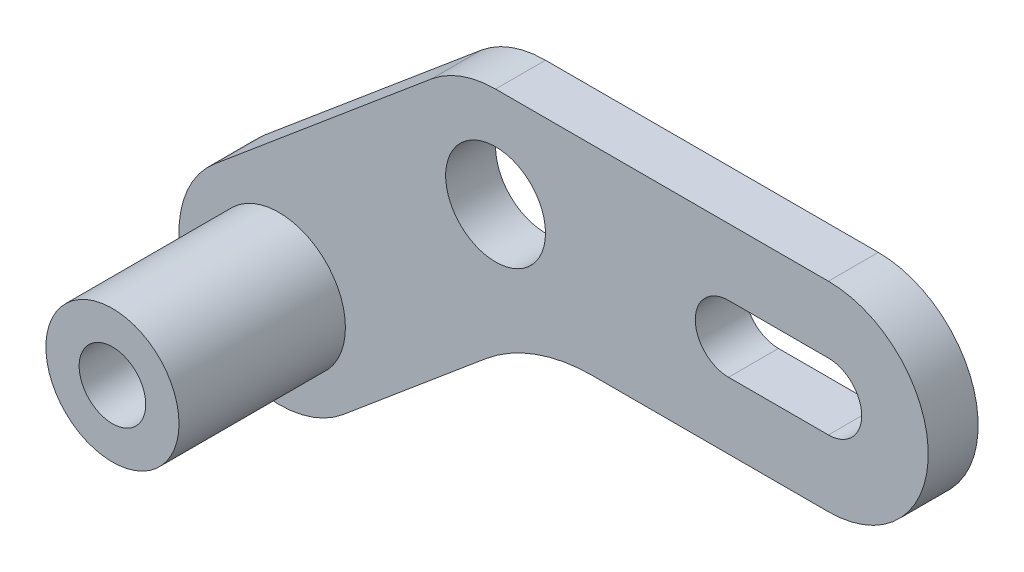
ISO-10303-21;
HEADER;
FILE_DESCRIPTION(('STEP AP214'),'2;1');
FILE_NAME('part.step','',(''),(''),'','','');
FILE_SCHEMA(('AUTOMOTIVE_DESIGN { 1 0 10303 214 1 1 1 1 }'));
ENDSEC;
DATA;
#1=APPLICATION_CONTEXT('core data for automotive mechanical design processes');
#2=APPLICATION_PROTOCOL_DEFINITION('international standard','automotive_design',2000,#1);
#3=PRODUCT_CONTEXT('',#1,'mechanical');
#4=PRODUCT('Part','Part','',(#3));
#5=PRODUCT_RELATED_PRODUCT_CATEGORY('part','',(#4));
#6=PRODUCT_DEFINITION_FORMATION('','',#4);
#7=PRODUCT_DEFINITION_CONTEXT('part definition',#1,'design');
#8=PRODUCT_DEFINITION('design','',#6,#7);
#9=PRODUCT_DEFINITION_SHAPE('','',#8);
#10=(LENGTH_UNIT() NAMED_UNIT(*) SI_UNIT(.MILLI.,.METRE.));
#11=(NAMED_UNIT(*) PLANE_ANGLE_UNIT() SI_UNIT($,.RADIAN.));
#12=(NAMED_UNIT(*) SI_UNIT($,.STERADIAN.) SOLID_ANGLE_UNIT());
#13=UNCERTAINTY_MEASURE_WITH_UNIT(LENGTH_MEASURE(1.E-05),#10,'distance_accuracy_value','');
#14=(GEOMETRIC_REPRESENTATION_CONTEXT(3) GLOBAL_UNCERTAINTY_ASSIGNED_CONTEXT((#13)) GLOBAL_UNIT_ASSIGNED_CONTEXT((#10,
#11,#12)) REPRESENTATION_CONTEXT('',''));
#15=CARTESIAN_POINT('',(0.,0.,0.));
#16=DIRECTION('',(0.,0.,1.));
#17=DIRECTION('',(1.,0.,0.));
#18=AXIS2_PLACEMENT_3D('',#15,#16,#17);
#19=CARTESIAN_POINT('',(0.,0.,3.));
#20=DIRECTION('',(0.,0.,1.));
#21=DIRECTION('',(1.,0.,0.));
#22=AXIS2_PLACEMENT_3D('',#19,#20,#21);
#23=PLANE('',#22);
#24=CARTESIAN_POINT('',(-20.,0.,3.));
#25=DIRECTION('',(0.,0.,1.));
#26=DIRECTION('',(1.,0.,0.));
#27=AXIS2_PLACEMENT_3D('',#24,#25,#26);
#28=CIRCLE('',#27,2.99999999999999);
#29=CARTESIAN_POINT('',(-17.,0.,3.));
#30=VERTEX_POINT('',#29);
#31=EDGE_CURVE('E174',#30,#30,#28,.T.);
#32=ORIENTED_EDGE('',*,*,#31,.F.);
#33=EDGE_LOOP('',(#32));
#34=FACE_BOUND('',#33,.T.);
#35=DIRECTION('',(-1.,0.,0.));
#36=VECTOR('',#35,1.);
#37=CARTESIAN_POINT('',(0.,6.,3.));
#38=LINE('',#37,#36);
#39=CARTESIAN_POINT('',(0.,6.,3.));
#40=VERTEX_POINT('',#39);
#41=CARTESIAN_POINT('',(-20.,6.,3.));
#42=VERTEX_POINT('',#41);
#43=EDGE_CURVE('E157',#40,#42,#38,.T.);
#44=ORIENTED_EDGE('',*,*,#43,.T.);
#45=CARTESIAN_POINT('',(-20.,0.,3.));
#46=DIRECTION('',(0.,0.,1.));
#47=DIRECTION('',(1.,0.,0.));
#48=AXIS2_PLACEMENT_3D('',#45,#46,#47);
#49=CIRCLE('',#48,6.);
#50=CARTESIAN_POINT('',(-23.8567256581192,4.59626665871387,3.));
#51=VERTEX_POINT('',#50);
#52=EDGE_CURVE('E160',#42,#51,#49,.T.);
#53=ORIENTED_EDGE('',*,*,#52,.T.);
#54=DIRECTION('',(0.766044443118977,0.64278760968654,0.));
#55=VECTOR('',#54,1.);
#56=CARTESIAN_POINT('',(-12.12024388145,14.444344188836,3.));
#57=LINE('',#56,#55);
#58=CARTESIAN_POINT('',(-36.8794811911419,-6.33112270595732,3.));
#59=VERTEX_POINT('',#58);
#60=EDGE_CURVE('E162',#59,#51,#57,.T.);
#61=ORIENTED_EDGE('',*,*,#60,.F.);
#62=CARTESIAN_POINT('',(-33.0227555330226,-10.9273893646712,3.));
#63=DIRECTION('',(0.,0.,1.));
#64=DIRECTION('',(1.,0.,0.));
#65=AXIS2_PLACEMENT_3D('',#62,#63,#64);
#66=CIRCLE('',#65,5.99999999999999);
#67=CARTESIAN_POINT('',(-29.1660298749034,-15.523656023385,3.));
#68=VERTEX_POINT('',#67);
#69=EDGE_CURVE('E165',#59,#68,#66,.T.);
#70=ORIENTED_EDGE('',*,*,#69,.T.);
#71=DIRECTION('',(0.766044443118977,0.64278760968654,0.));
#72=VECTOR('',#71,1.);
#73=CARTESIAN_POINT('',(-4.40679256521148,5.25181087140822,3.));
#74=LINE('',#73,#72);
#75=CARTESIAN_POINT('',(-20.6043523486061,-8.33955556881022,3.));
#76=VERTEX_POINT('',#75);
#77=EDGE_CURVE('E167',#68,#76,#74,.T.);
#78=ORIENTED_EDGE('',*,*,#77,.T.);
#79=CARTESIAN_POINT('',(-14.1764762517407,-16.,3.));
#80=DIRECTION('',(0.,0.,1.));
#81=DIRECTION('',(1.,0.,0.));
#82=AXIS2_PLACEMENT_3D('',#79,#80,#81);
#83=CIRCLE('',#82,10.);
#84=CARTESIAN_POINT('',(-14.1764762517407,-6.,3.));
#85=VERTEX_POINT('',#84);
#86=EDGE_CURVE('E11',#76,#85,#83,.F.);
#87=ORIENTED_EDGE('',*,*,#86,.T.);
#88=DIRECTION('',(-1.,0.,0.));
#89=VECTOR('',#88,1.);
#90=CARTESIAN_POINT('',(0.,-6.,3.));
#91=LINE('',#90,#89);
#92=CARTESIAN_POINT('',(0.,-6.,3.));
#93=VERTEX_POINT('',#92);
#94=EDGE_CURVE('E169',#93,#85,#91,.T.);
#95=ORIENTED_EDGE('',*,*,#94,.F.);
#96=CARTESIAN_POINT('',(0.,0.,3.));
#97=DIRECTION('',(0.,0.,1.));
#98=DIRECTION('',(1.,0.,0.));
#99=AXIS2_PLACEMENT_3D('',#96,#97,#98);
#100=CIRCLE('',#99,6.);
#101=EDGE_CURVE('E172',#93,#40,#100,.T.);
#102=ORIENTED_EDGE('',*,*,#101,.T.);
#103=EDGE_LOOP('',(#44,#53,#61,#70,#78,#87,#95,#102));
#104=FACE_BOUND('',#103,.T.);
#105=DIRECTION('',(1.,0.,0.));
#106=VECTOR('',#105,1.);
#107=CARTESIAN_POINT('',(0.,2.,3.));
#108=LINE('',#107,#106);
#109=CARTESIAN_POINT('',(-6.,2.,3.));
#110=VERTEX_POINT('',#109);
#111=CARTESIAN_POINT('',(0.,2.,3.));
#112=VERTEX_POINT('',#111);
#113=EDGE_CURVE('E127',#110,#112,#108,.T.);
#114=ORIENTED_EDGE('',*,*,#113,.T.);
#115=CARTESIAN_POINT('',(0.,0.,3.));
#116=DIRECTION('',(0.,0.,1.));
#117=DIRECTION('',(1.,0.,0.));
#118=AXIS2_PLACEMENT_3D('',#115,#116,#117);
#119=CIRCLE('',#118,2.);
#120=CARTESIAN_POINT('',(0.,-2.,3.));
#121=VERTEX_POINT('',#120);
#122=EDGE_CURVE('E132',#121,#112,#119,.T.);
#123=ORIENTED_EDGE('',*,*,#122,.F.);
#124=DIRECTION('',(1.,0.,0.));
#125=VECTOR('',#124,1.);
#126=CARTESIAN_POINT('',(0.,-2.,3.));
#127=LINE('',#126,#125);
#128=CARTESIAN_POINT('',(-6.,-2.,3.));
#129=VERTEX_POINT('',#128);
#130=EDGE_CURVE('E151',#129,#121,#127,.T.);
#131=ORIENTED_EDGE('',*,*,#130,.F.);
#132=CARTESIAN_POINT('',(-6.,0.,3.));
#133=DIRECTION('',(0.,0.,1.));
#134=DIRECTION('',(1.,0.,0.));
#135=AXIS2_PLACEMENT_3D('',#132,#133,#134);
#136=CIRCLE('',#135,2.);
#137=EDGE_CURVE('E135',#110,#129,#136,.T.);
#138=ORIENTED_EDGE('',*,*,#137,.F.);
#139=EDGE_LOOP('',(#114,#123,#131,#138));
#140=FACE_BOUND('',#139,.T.);
#141=CARTESIAN_POINT('',(-33.0227555330226,-10.9273893646712,3.));
#142=DIRECTION('',(0.,0.,1.));
#143=DIRECTION('',(1.,0.,0.));
#144=AXIS2_PLACEMENT_3D('',#141,#142,#143);
#145=CIRCLE('',#144,4.);
#146=CARTESIAN_POINT('',(-29.0227555330226,-10.9273893646712,3.));
#147=VERTEX_POINT('',#146);
#148=EDGE_CURVE('E389',#147,#147,#145,.T.);
#149=ORIENTED_EDGE('',*,*,#148,.F.);
#150=EDGE_LOOP('',(#149));
#151=FACE_BOUND('',#150,.T.);
#152=ADVANCED_FACE('F37',(#34,#104,#140,#151),#23,.T.);
#153=CARTESIAN_POINT('',(0.,6.,3.));
#154=DIRECTION('',(0.,-1.,0.));
#155=DIRECTION('',(1.,0.,0.));
#156=AXIS2_PLACEMENT_3D('',#153,#154,#155);
#157=PLANE('',#156);
#158=DIRECTION('',(-1.,0.,0.));
#159=VECTOR('',#158,1.);
#160=CARTESIAN_POINT('',(0.,6.,0.));
#161=LINE('',#160,#159);
#162=CARTESIAN_POINT('',(0.,6.,0.));
#163=VERTEX_POINT('',#162);
#164=CARTESIAN_POINT('',(-20.,6.,0.));
#165=VERTEX_POINT('',#164);
#166=EDGE_CURVE('E188',#163,#165,#161,.T.);
#167=ORIENTED_EDGE('',*,*,#166,.T.);
#168=DIRECTION('',(0.,0.,-1.));
#169=VECTOR('',#168,1.);
#170=CARTESIAN_POINT('',(-20.,6.,3.));
#171=LINE('',#170,#169);
#172=EDGE_CURVE('E221',#42,#165,#171,.T.);
#173=ORIENTED_EDGE('',*,*,#172,.F.);
#174=ORIENTED_EDGE('',*,*,#43,.F.);
#175=DIRECTION('',(0.,0.,-1.));
#176=VECTOR('',#175,1.);
#177=CARTESIAN_POINT('',(0.,6.,3.));
#178=LINE('',#177,#176);
#179=EDGE_CURVE('E147',#40,#163,#178,.T.);
#180=ORIENTED_EDGE('',*,*,#179,.T.);
#181=EDGE_LOOP('',(#167,#173,#174,#180));
#182=FACE_BOUND('',#181,.T.);
#183=ADVANCED_FACE('F248',(#182),#157,.F.);
#184=CARTESIAN_POINT('',(-20.,0.,3.));
#185=DIRECTION('',(0.,0.,-1.));
#186=DIRECTION('',(-1.,0.,0.));
#187=AXIS2_PLACEMENT_3D('',#184,#185,#186);
#188=CYLINDRICAL_SURFACE('',#187,6.);
#189=CARTESIAN_POINT('',(-20.,0.,0.));
#190=DIRECTION('',(0.,0.,1.));
#191=DIRECTION('',(1.,0.,0.));
#192=AXIS2_PLACEMENT_3D('',#189,#190,#191);
#193=CIRCLE('',#192,6.);
#194=CARTESIAN_POINT('',(-23.8567256581192,4.59626665871387,0.));
#195=VERTEX_POINT('',#194);
#196=EDGE_CURVE('E191',#165,#195,#193,.T.);
#197=ORIENTED_EDGE('',*,*,#196,.T.);
#198=DIRECTION('',(0.,0.,-1.));
#199=VECTOR('',#198,1.);
#200=CARTESIAN_POINT('',(-23.8567256581192,4.59626665871387,3.));
#201=LINE('',#200,#199);
#202=EDGE_CURVE('E219',#51,#195,#201,.T.);
#203=ORIENTED_EDGE('',*,*,#202,.F.);
#204=ORIENTED_EDGE('',*,*,#52,.F.);
#205=ORIENTED_EDGE('',*,*,#172,.T.);
#206=EDGE_LOOP('',(#197,#203,#204,#205));
#207=FACE_BOUND('',#206,.T.);
#208=ADVANCED_FACE('F271',(#207),#188,.T.);
#209=CARTESIAN_POINT('',(-12.12024388145,14.444344188836,3.));
#210=DIRECTION('',(-0.64278760968654,0.766044443118977,0.));
#211=DIRECTION('',(-0.766044443118977,-0.64278760968654,0.));
#212=AXIS2_PLACEMENT_3D('',#209,#210,#211);
#213=PLANE('',#212);
#214=DIRECTION('',(0.766044443118977,0.64278760968654,0.));
#215=VECTOR('',#214,1.);
#216=CARTESIAN_POINT('',(-12.12024388145,14.444344188836,0.));
#217=LINE('',#216,#215);
#218=CARTESIAN_POINT('',(-36.8794811911419,-6.33112270595732,0.));
#219=VERTEX_POINT('',#218);
#220=EDGE_CURVE('E194',#219,#195,#217,.T.);
#221=ORIENTED_EDGE('',*,*,#220,.F.);
#222=DIRECTION('',(0.,0.,-1.));
#223=VECTOR('',#222,1.);
#224=CARTESIAN_POINT('',(-36.8794811911419,-6.33112270595732,3.));
#225=LINE('',#224,#223);
#226=EDGE_CURVE('E217',#59,#219,#225,.T.);
#227=ORIENTED_EDGE('',*,*,#226,.F.);
#228=ORIENTED_EDGE('',*,*,#60,.T.);
#229=ORIENTED_EDGE('',*,*,#202,.T.);
#230=EDGE_LOOP('',(#221,#227,#228,#229));
#231=FACE_BOUND('',#230,.T.);
#232=ADVANCED_FACE('F295',(#231),#213,.T.);
#233=CARTESIAN_POINT('',(-33.0227555330226,-10.9273893646712,3.));
#234=DIRECTION('',(0.,0.,-1.));
#235=DIRECTION('',(-1.,0.,0.));
#236=AXIS2_PLACEMENT_3D('',#233,#234,#235);
#237=CYLINDRICAL_SURFACE('',#236,5.99999999999999);
#238=CARTESIAN_POINT('',(-33.0227555330226,-10.9273893646712,0.));
#239=DIRECTION('',(0.,0.,1.));
#240=DIRECTION('',(1.,0.,0.));
#241=AXIS2_PLACEMENT_3D('',#238,#239,#240);
#242=CIRCLE('',#241,5.99999999999999);
#243=CARTESIAN_POINT('',(-29.1660298749034,-15.523656023385,0.));
#244=VERTEX_POINT('',#243);
#245=EDGE_CURVE('E197',#219,#244,#242,.T.);
#246=ORIENTED_EDGE('',*,*,#245,.T.);
#247=DIRECTION('',(0.,0.,-1.));
#248=VECTOR('',#247,1.);
#249=CARTESIAN_POINT('',(-29.1660298749034,-15.523656023385,3.));
#250=LINE('',#249,#248);
#251=EDGE_CURVE('E214',#68,#244,#250,.T.);
#252=ORIENTED_EDGE('',*,*,#251,.F.);
#253=ORIENTED_EDGE('',*,*,#69,.F.);
#254=ORIENTED_EDGE('',*,*,#226,.T.);
#255=EDGE_LOOP('',(#246,#252,#253,#254));
#256=FACE_BOUND('',#255,.T.);
#257=ADVANCED_FACE('F292',(#256),#237,.T.);
#258=CARTESIAN_POINT('',(-4.40679256521148,5.25181087140822,3.));
#259=DIRECTION('',(-0.64278760968654,0.766044443118977,0.));
#260=DIRECTION('',(-0.766044443118977,-0.64278760968654,0.));
#261=AXIS2_PLACEMENT_3D('',#258,#259,#260);
#262=PLANE('',#261);
#263=DIRECTION('',(0.766044443118977,0.64278760968654,0.));
#264=VECTOR('',#263,1.);
#265=CARTESIAN_POINT('',(-4.40679256521148,5.25181087140822,0.));
#266=LINE('',#265,#264);
#267=CARTESIAN_POINT('',(-20.6043523486061,-8.33955556881022,0.));
#268=VERTEX_POINT('',#267);
#269=EDGE_CURVE('E199',#244,#268,#266,.T.);
#270=ORIENTED_EDGE('',*,*,#269,.T.);
#271=DIRECTION('',(0.,0.,-1.));
#272=VECTOR('',#271,1.);
#273=CARTESIAN_POINT('',(-20.6043523486061,-8.33955556881023,3.));
#274=LINE('',#273,#272);
#275=EDGE_CURVE('E52',#268,#76,#274,.F.);
#276=ORIENTED_EDGE('',*,*,#275,.T.);
#277=ORIENTED_EDGE('',*,*,#77,.F.);
#278=ORIENTED_EDGE('',*,*,#251,.T.);
#279=EDGE_LOOP('',(#270,#276,#277,#278));
#280=FACE_BOUND('',#279,.T.);
#281=ADVANCED_FACE('F289',(#280),#262,.F.);
#282=CARTESIAN_POINT('',(0.,-6.,3.));
#283=DIRECTION('',(0.,-1.,0.));
#284=DIRECTION('',(1.,0.,0.));
#285=AXIS2_PLACEMENT_3D('',#282,#283,#284);
#286=PLANE('',#285);
#287=ORIENTED_EDGE('',*,*,#94,.T.);
#288=DIRECTION('',(0.,0.,-1.));
#289=VECTOR('',#288,1.);
#290=CARTESIAN_POINT('',(-14.1764762517407,-6.,3.));
#291=LINE('',#290,#289);
#292=CARTESIAN_POINT('',(-14.1764762517407,-6.,0.));
#293=VERTEX_POINT('',#292);
#294=EDGE_CURVE('E224',#85,#293,#291,.T.);
#295=ORIENTED_EDGE('',*,*,#294,.T.);
#296=DIRECTION('',(-1.,0.,0.));
#297=VECTOR('',#296,1.);
#298=CARTESIAN_POINT('',(0.,-6.,0.));
#299=LINE('',#298,#297);
#300=CARTESIAN_POINT('',(0.,-6.,0.));
#301=VERTEX_POINT('',#300);
#302=EDGE_CURVE('E201',#301,#293,#299,.T.);
#303=ORIENTED_EDGE('',*,*,#302,.F.);
#304=DIRECTION('',(0.,0.,-1.));
#305=VECTOR('',#304,1.);
#306=CARTESIAN_POINT('',(0.,-6.,3.));
#307=LINE('',#306,#305);
#308=EDGE_CURVE('E212',#93,#301,#307,.T.);
#309=ORIENTED_EDGE('',*,*,#308,.F.);
#310=EDGE_LOOP('',(#287,#295,#303,#309));
#311=FACE_BOUND('',#310,.T.);
#312=ADVANCED_FACE('F234',(#311),#286,.T.);
#313=CARTESIAN_POINT('',(0.,2.,3.));
#314=DIRECTION('',(0.,1.,0.));
#315=DIRECTION('',(-1.,0.,0.));
#316=AXIS2_PLACEMENT_3D('',#313,#314,#315);
#317=PLANE('',#316);
#318=DIRECTION('',(1.,0.,0.));
#319=VECTOR('',#318,1.);
#320=CARTESIAN_POINT('',(0.,2.,0.));
#321=LINE('',#320,#319);
#322=CARTESIAN_POINT('',(-6.,2.,0.));
#323=VERTEX_POINT('',#322);
#324=CARTESIAN_POINT('',(0.,2.,0.));
#325=VERTEX_POINT('',#324);
#326=EDGE_CURVE('E143',#323,#325,#321,.T.);
#327=ORIENTED_EDGE('',*,*,#326,.T.);
#328=DIRECTION('',(0.,0.,-1.));
#329=VECTOR('',#328,1.);
#330=CARTESIAN_POINT('',(0.,2.,3.));
#331=LINE('',#330,#329);
#332=EDGE_CURVE('E140',#112,#325,#331,.T.);
#333=ORIENTED_EDGE('',*,*,#332,.F.);
#334=ORIENTED_EDGE('',*,*,#113,.F.);
#335=DIRECTION('',(0.,0.,-1.));
#336=VECTOR('',#335,1.);
#337=CARTESIAN_POINT('',(-6.,2.,3.));
#338=LINE('',#337,#336);
#339=EDGE_CURVE('E177',#110,#323,#338,.T.);
#340=ORIENTED_EDGE('',*,*,#339,.T.);
#341=EDGE_LOOP('',(#327,#333,#334,#340));
#342=FACE_BOUND('',#341,.T.);
#343=ADVANCED_FACE('F141',(#342),#317,.F.);
#344=CARTESIAN_POINT('',(0.,0.,3.));
#345=DIRECTION('',(0.,0.,-1.));
#346=DIRECTION('',(-1.,0.,0.));
#347=AXIS2_PLACEMENT_3D('',#344,#345,#346);
#348=CYLINDRICAL_SURFACE('',#347,2.);
#349=CARTESIAN_POINT('',(0.,0.,0.));
#350=DIRECTION('',(0.,0.,1.));
#351=DIRECTION('',(1.,0.,0.));
#352=AXIS2_PLACEMENT_3D('',#349,#350,#351);
#353=CIRCLE('',#352,2.);
#354=CARTESIAN_POINT('',(0.,-2.,0.));
#355=VERTEX_POINT('',#354);
#356=EDGE_CURVE('E179',#355,#325,#353,.T.);
#357=ORIENTED_EDGE('',*,*,#356,.F.);
#358=DIRECTION('',(0.,0.,-1.));
#359=VECTOR('',#358,1.);
#360=CARTESIAN_POINT('',(0.,-2.,3.));
#361=LINE('',#360,#359);
#362=EDGE_CURVE('E148',#121,#355,#361,.T.);
#363=ORIENTED_EDGE('',*,*,#362,.F.);
#364=ORIENTED_EDGE('',*,*,#122,.T.);
#365=ORIENTED_EDGE('',*,*,#332,.T.);
#366=EDGE_LOOP('',(#357,#363,#364,#365));
#367=FACE_BOUND('',#366,.T.);
#368=ADVANCED_FACE('F150',(#367),#348,.F.);
#369=CARTESIAN_POINT('',(0.,-2.,3.));
#370=DIRECTION('',(0.,1.,0.));
#371=DIRECTION('',(-1.,0.,0.));
#372=AXIS2_PLACEMENT_3D('',#369,#370,#371);
#373=PLANE('',#372);
#374=DIRECTION('',(1.,0.,0.));
#375=VECTOR('',#374,1.);
#376=CARTESIAN_POINT('',(0.,-2.,0.));
#377=LINE('',#376,#375);
#378=CARTESIAN_POINT('',(-6.,-2.,0.));
#379=VERTEX_POINT('',#378);
#380=EDGE_CURVE('E182',#379,#355,#377,.T.);
#381=ORIENTED_EDGE('',*,*,#380,.F.);
#382=DIRECTION('',(0.,0.,-1.));
#383=VECTOR('',#382,1.);
#384=CARTESIAN_POINT('',(-6.,-2.,3.));
#385=LINE('',#384,#383);
#386=EDGE_CURVE('E226',#129,#379,#385,.T.);
#387=ORIENTED_EDGE('',*,*,#386,.F.);
#388=ORIENTED_EDGE('',*,*,#130,.T.);
#389=ORIENTED_EDGE('',*,*,#362,.T.);
#390=EDGE_LOOP('',(#381,#387,#388,#389));
#391=FACE_BOUND('',#390,.T.);
#392=ADVANCED_FACE('F283',(#391),#373,.T.);
#393=CARTESIAN_POINT('',(-33.0227555330226,-10.9273893646712,3.));
#394=DIRECTION('',(0.,0.,-1.));
#395=DIRECTION('',(-1.,0.,0.));
#396=AXIS2_PLACEMENT_3D('',#393,#394,#395);
#397=CYLINDRICAL_SURFACE('',#396,2.);
#398=CARTESIAN_POINT('',(-33.0227555330226,-10.9273893646712,0.));
#399=DIRECTION('',(0.,0.,1.));
#400=DIRECTION('',(1.,0.,0.));
#401=AXIS2_PLACEMENT_3D('',#398,#399,#400);
#402=CIRCLE('',#401,2.);
#403=CARTESIAN_POINT('',(-31.0227555330226,-10.9273893646712,0.));
#404=VERTEX_POINT('',#403);
#405=EDGE_CURVE('E205',#404,#404,#402,.T.);
#406=ORIENTED_EDGE('',*,*,#405,.F.);
#407=EDGE_LOOP('',(#406));
#408=FACE_BOUND('',#407,.T.);
#409=CARTESIAN_POINT('',(-33.0227555330226,-10.9273893646712,13.));
#410=DIRECTION('',(0.,0.,1.));
#411=DIRECTION('',(1.,0.,0.));
#412=AXIS2_PLACEMENT_3D('',#409,#410,#411);
#413=CIRCLE('',#412,2.);
#414=CARTESIAN_POINT('',(-31.0227555330226,-10.9273893646712,13.));
#415=VERTEX_POINT('',#414);
#416=EDGE_CURVE('E390',#415,#415,#413,.T.);
#417=ORIENTED_EDGE('',*,*,#416,.T.);
#418=EDGE_LOOP('',(#417));
#419=FACE_BOUND('',#418,.T.);
#420=ADVANCED_FACE('F280',(#408,#419),#397,.F.);
#421=CARTESIAN_POINT('',(0.,0.,3.));
#422=DIRECTION('',(0.,0.,-1.));
#423=DIRECTION('',(-1.,0.,0.));
#424=AXIS2_PLACEMENT_3D('',#421,#422,#423);
#425=CYLINDRICAL_SURFACE('',#424,6.);
#426=CARTESIAN_POINT('',(0.,0.,0.));
#427=DIRECTION('',(0.,0.,1.));
#428=DIRECTION('',(1.,0.,0.));
#429=AXIS2_PLACEMENT_3D('',#426,#427,#428);
#430=CIRCLE('',#429,6.);
#431=EDGE_CURVE('E203',#301,#163,#430,.T.);
#432=ORIENTED_EDGE('',*,*,#431,.T.);
#433=ORIENTED_EDGE('',*,*,#179,.F.);
#434=ORIENTED_EDGE('',*,*,#101,.F.);
#435=ORIENTED_EDGE('',*,*,#308,.T.);
#436=EDGE_LOOP('',(#432,#433,#434,#435));
#437=FACE_BOUND('',#436,.T.);
#438=ADVANCED_FACE('F244',(#437),#425,.T.);
#439=CARTESIAN_POINT('',(-6.,0.,3.));
#440=DIRECTION('',(0.,0.,-1.));
#441=DIRECTION('',(-1.,0.,0.));
#442=AXIS2_PLACEMENT_3D('',#439,#440,#441);
#443=CYLINDRICAL_SURFACE('',#442,2.);
#444=CARTESIAN_POINT('',(-6.,0.,0.));
#445=DIRECTION('',(0.,0.,1.));
#446=DIRECTION('',(1.,0.,0.));
#447=AXIS2_PLACEMENT_3D('',#444,#445,#446);
#448=CIRCLE('',#447,2.);
#449=EDGE_CURVE('E185',#323,#379,#448,.T.);
#450=ORIENTED_EDGE('',*,*,#449,.F.);
#451=ORIENTED_EDGE('',*,*,#339,.F.);
#452=ORIENTED_EDGE('',*,*,#137,.T.);
#453=ORIENTED_EDGE('',*,*,#386,.T.);
#454=EDGE_LOOP('',(#450,#451,#452,#453));
#455=FACE_BOUND('',#454,.T.);
#456=ADVANCED_FACE('F278',(#455),#443,.F.);
#457=CARTESIAN_POINT('',(-20.,0.,3.));
#458=DIRECTION('',(0.,0.,-1.));
#459=DIRECTION('',(-1.,0.,0.));
#460=AXIS2_PLACEMENT_3D('',#457,#458,#459);
#461=CYLINDRICAL_SURFACE('',#460,2.99999999999999);
#462=ORIENTED_EDGE('',*,*,#31,.T.);
#463=EDGE_LOOP('',(#462));
#464=FACE_BOUND('',#463,.T.);
#465=CARTESIAN_POINT('',(-20.,0.,0.));
#466=DIRECTION('',(0.,0.,1.));
#467=DIRECTION('',(1.,0.,0.));
#468=AXIS2_PLACEMENT_3D('',#465,#466,#467);
#469=CIRCLE('',#468,2.99999999999999);
#470=CARTESIAN_POINT('',(-17.,0.,0.));
#471=VERTEX_POINT('',#470);
#472=EDGE_CURVE('E137',#471,#471,#469,.T.);
#473=ORIENTED_EDGE('',*,*,#472,.F.);
#474=EDGE_LOOP('',(#473));
#475=FACE_BOUND('',#474,.T.);
#476=ADVANCED_FACE('F262',(#464,#475),#461,.F.);
#477=CARTESIAN_POINT('',(0.,0.,0.));
#478=DIRECTION('',(0.,0.,1.));
#479=DIRECTION('',(1.,0.,0.));
#480=AXIS2_PLACEMENT_3D('',#477,#478,#479);
#481=PLANE('',#480);
#482=ORIENTED_EDGE('',*,*,#326,.F.);
#483=ORIENTED_EDGE('',*,*,#449,.T.);
#484=ORIENTED_EDGE('',*,*,#380,.T.);
#485=ORIENTED_EDGE('',*,*,#356,.T.);
#486=EDGE_LOOP('',(#482,#483,#484,#485));
#487=FACE_BOUND('',#486,.T.);
#488=ORIENTED_EDGE('',*,*,#166,.F.);
#489=ORIENTED_EDGE('',*,*,#431,.F.);
#490=ORIENTED_EDGE('',*,*,#302,.T.);
#491=CARTESIAN_POINT('',(-14.1764762517407,-16.,0.));
#492=DIRECTION('',(0.,0.,1.));
#493=DIRECTION('',(1.,0.,0.));
#494=AXIS2_PLACEMENT_3D('',#491,#492,#493);
#495=CIRCLE('',#494,10.);
#496=EDGE_CURVE('E45',#293,#268,#495,.T.);
#497=ORIENTED_EDGE('',*,*,#496,.T.);
#498=ORIENTED_EDGE('',*,*,#269,.F.);
#499=ORIENTED_EDGE('',*,*,#245,.F.);
#500=ORIENTED_EDGE('',*,*,#220,.T.);
#501=ORIENTED_EDGE('',*,*,#196,.F.);
#502=EDGE_LOOP('',(#488,#489,#490,#497,#498,#499,#500,#501));
#503=FACE_BOUND('',#502,.T.);
#504=ORIENTED_EDGE('',*,*,#405,.T.);
#505=EDGE_LOOP('',(#504));
#506=FACE_BOUND('',#505,.T.);
#507=ORIENTED_EDGE('',*,*,#472,.T.);
#508=EDGE_LOOP('',(#507));
#509=FACE_BOUND('',#508,.T.);
#510=ADVANCED_FACE('F240',(#487,#503,#506,#509),#481,.F.);
#511=CARTESIAN_POINT('',(-14.1764762517407,-16.,3.));
#512=DIRECTION('',(0.,0.,-1.));
#513=DIRECTION('',(-1.,0.,0.));
#514=AXIS2_PLACEMENT_3D('',#511,#512,#513);
#515=CYLINDRICAL_SURFACE('',#514,10.);
#516=ORIENTED_EDGE('',*,*,#86,.F.);
#517=ORIENTED_EDGE('',*,*,#275,.F.);
#518=ORIENTED_EDGE('',*,*,#496,.F.);
#519=ORIENTED_EDGE('',*,*,#294,.F.);
#520=EDGE_LOOP('',(#516,#517,#518,#519));
#521=FACE_BOUND('',#520,.T.);
#522=ADVANCED_FACE('F39',(#521),#515,.F.);
#523=CARTESIAN_POINT('',(-33.0227555330226,-10.9273893646712,13.));
#524=DIRECTION('',(0.,0.,1.));
#525=DIRECTION('',(1.,0.,0.));
#526=AXIS2_PLACEMENT_3D('',#523,#524,#525);
#527=PLANE('',#526);
#528=CARTESIAN_POINT('',(-33.0227555330226,-10.9273893646712,13.));
#529=DIRECTION('',(0.,0.,1.));
#530=DIRECTION('',(1.,0.,0.));
#531=AXIS2_PLACEMENT_3D('',#528,#529,#530);
#532=CIRCLE('',#531,4.);
#533=CARTESIAN_POINT('',(-29.0227555330226,-10.9273893646712,13.));
#534=VERTEX_POINT('',#533);
#535=EDGE_CURVE('E180',#534,#534,#532,.T.);
#536=ORIENTED_EDGE('',*,*,#535,.T.);
#537=EDGE_LOOP('',(#536));
#538=FACE_BOUND('',#537,.T.);
#539=ORIENTED_EDGE('',*,*,#416,.F.);
#540=EDGE_LOOP('',(#539));
#541=FACE_BOUND('',#540,.T.);
#542=ADVANCED_FACE('F254',(#538,#541),#527,.T.);
#543=CARTESIAN_POINT('',(-33.0227555330226,-10.9273893646712,13.));
#544=DIRECTION('',(0.,0.,-1.));
#545=DIRECTION('',(-1.,0.,0.));
#546=AXIS2_PLACEMENT_3D('',#543,#544,#545);
#547=CYLINDRICAL_SURFACE('',#546,4.);
#548=ORIENTED_EDGE('',*,*,#535,.F.);
#549=EDGE_LOOP('',(#548));
#550=FACE_BOUND('',#549,.T.);
#551=ORIENTED_EDGE('',*,*,#148,.T.);
#552=EDGE_LOOP('',(#551));
#553=FACE_BOUND('',#552,.T.);
#554=ADVANCED_FACE('F259',(#550,#553),#547,.T.);
#555=CLOSED_SHELL('',(#152,#183,#208,#232,#257,#281,#312,#343,#368,#392,#420,#438,#456,#476,
#510,#522,#542,#554));
#556=MANIFOLD_SOLID_BREP('B2',#555);
#557=ADVANCED_BREP_SHAPE_REPRESENTATION('',(#18,#556),#14);
#558=SHAPE_DEFINITION_REPRESENTATION(#9,#557);
ENDSEC;
END-ISO-10303-21;
